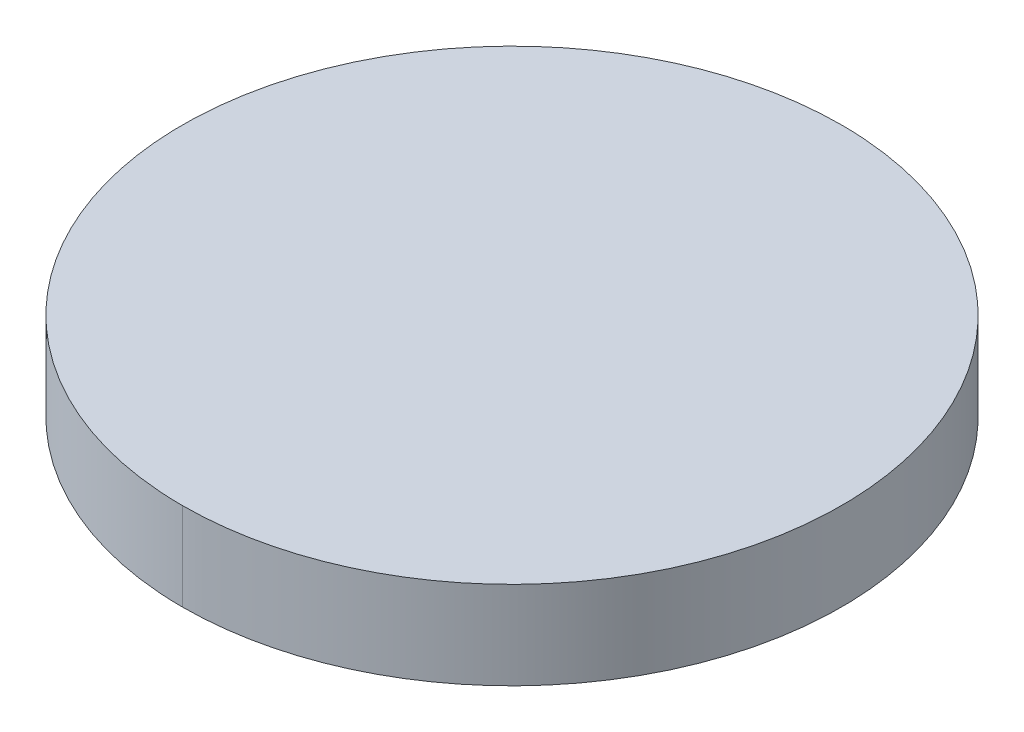
ISO-10303-21;
HEADER;
FILE_DESCRIPTION(('STEP AP214'),'2;1');
FILE_NAME('part.step','',(''),(''),'','','');
FILE_SCHEMA(('AUTOMOTIVE_DESIGN { 1 0 10303 214 1 1 1 1 }'));
ENDSEC;
DATA;
#1=APPLICATION_CONTEXT('core data for automotive mechanical design processes');
#2=APPLICATION_PROTOCOL_DEFINITION('international standard','automotive_design',2000,#1);
#3=PRODUCT_CONTEXT('',#1,'mechanical');
#4=PRODUCT('Part','Part','',(#3));
#5=PRODUCT_RELATED_PRODUCT_CATEGORY('part','',(#4));
#6=PRODUCT_DEFINITION_FORMATION('','',#4);
#7=PRODUCT_DEFINITION_CONTEXT('part definition',#1,'design');
#8=PRODUCT_DEFINITION('design','',#6,#7);
#9=PRODUCT_DEFINITION_SHAPE('','',#8);
#10=(LENGTH_UNIT() NAMED_UNIT(*) SI_UNIT(.MILLI.,.METRE.));
#11=(NAMED_UNIT(*) PLANE_ANGLE_UNIT() SI_UNIT($,.RADIAN.));
#12=(NAMED_UNIT(*) SI_UNIT($,.STERADIAN.) SOLID_ANGLE_UNIT());
#13=UNCERTAINTY_MEASURE_WITH_UNIT(LENGTH_MEASURE(1.E-05),#10,'distance_accuracy_value','');
#14=(GEOMETRIC_REPRESENTATION_CONTEXT(3) GLOBAL_UNCERTAINTY_ASSIGNED_CONTEXT((#13)) GLOBAL_UNIT_ASSIGNED_CONTEXT((#10,
#11,#12)) REPRESENTATION_CONTEXT('',''));
#15=CARTESIAN_POINT('',(0.,0.,0.));
#16=DIRECTION('',(0.,0.,1.));
#17=DIRECTION('',(1.,0.,0.));
#18=AXIS2_PLACEMENT_3D('',#15,#16,#17);
#19=CARTESIAN_POINT('',(-0.75,0.,-0.75));
#20=CARTESIAN_POINT('',(0.75,0.,-0.75));
#21=CARTESIAN_POINT('',(-0.75,0.,0.75));
#22=CARTESIAN_POINT('',(0.75,0.,0.75));
#23=(BOUNDED_SURFACE() B_SPLINE_SURFACE(1,1,((#19,#20),(#21,#22)),.UNSPECIFIED.,.F.,.F.,
.F.) B_SPLINE_SURFACE_WITH_KNOTS((2,2),(2,2),(-0.75,0.75),(-0.75,0.75),
.UNSPECIFIED.) GEOMETRIC_REPRESENTATION_ITEM() RATIONAL_B_SPLINE_SURFACE(((1.,1.),(1.,1.))) REPRESENTATION_ITEM('') SURFACE());
#24=CARTESIAN_POINT('',(0.,0.,-0.75));
#25=CARTESIAN_POINT('',(-0.75,0.,-0.75));
#26=CARTESIAN_POINT('',(-0.75,0.,0.));
#27=CARTESIAN_POINT('',(-0.75,0.,0.75));
#28=CARTESIAN_POINT('',(0.,0.,0.75));
#29=(BOUNDED_CURVE() B_SPLINE_CURVE(2,(#24,#25,#26,#27,#28),.UNSPECIFIED.,.F.,
.F.) B_SPLINE_CURVE_WITH_KNOTS((3,2,3),(3.14159265359,4.712388980385,6.28318530718),
.UNSPECIFIED.) CURVE() GEOMETRIC_REPRESENTATION_ITEM() RATIONAL_B_SPLINE_CURVE((1.,
0.707106781187,1.,0.707106781187,1.)) REPRESENTATION_ITEM(''));
#30=CARTESIAN_POINT('',(0.,0.,-0.75));
#31=VERTEX_POINT('',#30);
#32=CARTESIAN_POINT('',(0.,0.,0.75));
#33=VERTEX_POINT('',#32);
#34=EDGE_CURVE('E11',#31,#33,#29,.T.);
#35=CARTESIAN_POINT('',(0.,0.,0.75));
#36=CARTESIAN_POINT('',(0.75,0.,0.75));
#37=CARTESIAN_POINT('',(0.75,0.,0.));
#38=CARTESIAN_POINT('',(0.75,0.,-0.75));
#39=CARTESIAN_POINT('',(0.,0.,-0.75));
#40=(BOUNDED_CURVE() B_SPLINE_CURVE(2,(#35,#36,#37,#38,#39),.UNSPECIFIED.,.F.,
.F.) B_SPLINE_CURVE_WITH_KNOTS((3,2,3),(0.,1.570796326795,3.14159265359),
.UNSPECIFIED.) CURVE() GEOMETRIC_REPRESENTATION_ITEM() RATIONAL_B_SPLINE_CURVE((1.,
0.707106781187,1.,0.707106781187,1.)) REPRESENTATION_ITEM(''));
#41=EDGE_CURVE('E66',#33,#31,#40,.T.);
#42=ORIENTED_EDGE('',*,*,#34,.F.);
#43=ORIENTED_EDGE('',*,*,#41,.F.);
#44=EDGE_LOOP('',(#42,#43));
#45=FACE_BOUND('',#44,.T.);
#46=ADVANCED_FACE('F16',(#45),#23,.F.);
#47=CARTESIAN_POINT('',(-0.75,0.2,-0.75));
#48=CARTESIAN_POINT('',(0.75,0.2,-0.75));
#49=CARTESIAN_POINT('',(-0.75,0.2,0.75));
#50=CARTESIAN_POINT('',(0.75,0.2,0.75));
#51=(BOUNDED_SURFACE() B_SPLINE_SURFACE(1,1,((#47,#48),(#49,#50)),.UNSPECIFIED.,.F.,.F.,
.F.) B_SPLINE_SURFACE_WITH_KNOTS((2,2),(2,2),(-0.75,0.75),(-0.75,0.75),
.UNSPECIFIED.) GEOMETRIC_REPRESENTATION_ITEM() RATIONAL_B_SPLINE_SURFACE(((1.,1.),(1.,1.))) REPRESENTATION_ITEM('') SURFACE());
#52=CARTESIAN_POINT('',(0.,0.2,-0.75));
#53=CARTESIAN_POINT('',(-0.75,0.2,-0.75));
#54=CARTESIAN_POINT('',(-0.75,0.2,0.));
#55=CARTESIAN_POINT('',(-0.75,0.2,0.75));
#56=CARTESIAN_POINT('',(0.,0.2,0.75));
#57=(BOUNDED_CURVE() B_SPLINE_CURVE(2,(#52,#53,#54,#55,#56),.UNSPECIFIED.,.F.,
.F.) B_SPLINE_CURVE_WITH_KNOTS((3,2,3),(3.14159265359,4.712388980385,6.28318530718),
.UNSPECIFIED.) CURVE() GEOMETRIC_REPRESENTATION_ITEM() RATIONAL_B_SPLINE_CURVE((1.,
0.707106781187,1.,0.707106781187,1.)) REPRESENTATION_ITEM(''));
#58=CARTESIAN_POINT('',(0.,0.2,-0.75));
#59=VERTEX_POINT('',#58);
#60=CARTESIAN_POINT('',(0.,0.2,0.75));
#61=VERTEX_POINT('',#60);
#62=EDGE_CURVE('E29',#59,#61,#57,.T.);
#63=CARTESIAN_POINT('',(0.,0.2,0.75));
#64=CARTESIAN_POINT('',(0.75,0.2,0.75));
#65=CARTESIAN_POINT('',(0.75,0.2,0.));
#66=CARTESIAN_POINT('',(0.75,0.2,-0.75));
#67=CARTESIAN_POINT('',(0.,0.2,-0.75));
#68=(BOUNDED_CURVE() B_SPLINE_CURVE(2,(#63,#64,#65,#66,#67),.UNSPECIFIED.,.F.,
.F.) B_SPLINE_CURVE_WITH_KNOTS((3,2,3),(0.,1.570796326795,3.14159265359),
.UNSPECIFIED.) CURVE() GEOMETRIC_REPRESENTATION_ITEM() RATIONAL_B_SPLINE_CURVE((1.,
0.707106781187,1.,0.707106781187,1.)) REPRESENTATION_ITEM(''));
#69=EDGE_CURVE('E56',#61,#59,#68,.T.);
#70=ORIENTED_EDGE('',*,*,#62,.T.);
#71=ORIENTED_EDGE('',*,*,#69,.T.);
#72=EDGE_LOOP('',(#70,#71));
#73=FACE_BOUND('',#72,.T.);
#74=ADVANCED_FACE('F18',(#73),#51,.T.);
#75=CARTESIAN_POINT('',(0.,0.2,0.75));
#76=CARTESIAN_POINT('',(0.,0.,0.75));
#77=CARTESIAN_POINT('',(-0.75,0.2,0.75));
#78=CARTESIAN_POINT('',(-0.75,0.,0.75));
#79=CARTESIAN_POINT('',(-0.75,0.2,0.));
#80=CARTESIAN_POINT('',(-0.75,0.,0.));
#81=CARTESIAN_POINT('',(-0.75,0.2,-0.75));
#82=CARTESIAN_POINT('',(-0.75,0.,-0.75));
#83=CARTESIAN_POINT('',(0.,0.2,-0.75));
#84=CARTESIAN_POINT('',(0.,0.,-0.75));
#85=(BOUNDED_SURFACE() B_SPLINE_SURFACE(2,1,((#75,#76),(#77,#78),(#79,#80),(#81,#82),(#83,#84)),
.UNSPECIFIED.,.F.,.F.,.F.) B_SPLINE_SURFACE_WITH_KNOTS((3,2,3),(2,2),(3.14159265359,
4.712388980385,6.28318530718),(0.,0.2),
.UNSPECIFIED.) GEOMETRIC_REPRESENTATION_ITEM() RATIONAL_B_SPLINE_SURFACE(((1.,1.),
(0.707106781187,0.707106781187),(1.,1.),(0.707106781187,0.707106781187),(1.,1.))) REPRESENTATION_ITEM('') SURFACE());
#86=CARTESIAN_POINT('',(0.,0.2,0.75));
#87=CARTESIAN_POINT('',(0.,0.,0.75));
#88=(BOUNDED_CURVE() B_SPLINE_CURVE(1,(#86,#87),.UNSPECIFIED.,.F.,
.F.) B_SPLINE_CURVE_WITH_KNOTS((2,2),(0.,0.2),
.UNSPECIFIED.) CURVE() GEOMETRIC_REPRESENTATION_ITEM() RATIONAL_B_SPLINE_CURVE((1.,1.)) REPRESENTATION_ITEM(''));
#89=EDGE_CURVE('E61',#61,#33,#88,.T.);
#90=CARTESIAN_POINT('',(0.,0.2,-0.75));
#91=CARTESIAN_POINT('',(0.,0.,-0.75));
#92=(BOUNDED_CURVE() B_SPLINE_CURVE(1,(#90,#91),.UNSPECIFIED.,.F.,
.F.) B_SPLINE_CURVE_WITH_KNOTS((2,2),(0.,0.2),
.UNSPECIFIED.) CURVE() GEOMETRIC_REPRESENTATION_ITEM() RATIONAL_B_SPLINE_CURVE((1.,1.)) REPRESENTATION_ITEM(''));
#93=EDGE_CURVE('E59',#59,#31,#92,.T.);
#94=ORIENTED_EDGE('',*,*,#89,.F.);
#95=ORIENTED_EDGE('',*,*,#62,.F.);
#96=ORIENTED_EDGE('',*,*,#93,.T.);
#97=ORIENTED_EDGE('',*,*,#34,.T.);
#98=EDGE_LOOP('',(#94,#95,#96,#97));
#99=FACE_BOUND('',#98,.T.);
#100=ADVANCED_FACE('F62',(#99),#85,.T.);
#101=CARTESIAN_POINT('',(0.,0.2,-0.75));
#102=CARTESIAN_POINT('',(0.,0.,-0.75));
#103=CARTESIAN_POINT('',(0.75,0.2,-0.75));
#104=CARTESIAN_POINT('',(0.75,0.,-0.75));
#105=CARTESIAN_POINT('',(0.75,0.2,0.));
#106=CARTESIAN_POINT('',(0.75,0.,0.));
#107=CARTESIAN_POINT('',(0.75,0.2,0.75));
#108=CARTESIAN_POINT('',(0.75,0.,0.75));
#109=CARTESIAN_POINT('',(0.,0.2,0.75));
#110=CARTESIAN_POINT('',(0.,0.,0.75));
#111=(BOUNDED_SURFACE() B_SPLINE_SURFACE(2,1,((#101,#102),(#103,#104),(#105,#106),(#107,#108),
(#109,#110)),.UNSPECIFIED.,.F.,.F.,.F.) B_SPLINE_SURFACE_WITH_KNOTS((3,2,3),(2,2),(0.,
1.570796326795,3.14159265359),(0.,0.2),
.UNSPECIFIED.) GEOMETRIC_REPRESENTATION_ITEM() RATIONAL_B_SPLINE_SURFACE(((1.,1.),
(0.707106781187,0.707106781187),(1.,1.),(0.707106781187,0.707106781187),(1.,1.))) REPRESENTATION_ITEM('') SURFACE());
#112=ORIENTED_EDGE('',*,*,#69,.F.);
#113=ORIENTED_EDGE('',*,*,#89,.T.);
#114=ORIENTED_EDGE('',*,*,#41,.T.);
#115=ORIENTED_EDGE('',*,*,#93,.F.);
#116=EDGE_LOOP('',(#112,#113,#114,#115));
#117=FACE_BOUND('',#116,.T.);
#118=ADVANCED_FACE('F68',(#117),#111,.T.);
#119=CLOSED_SHELL('',(#46,#74,#100,#118));
#120=MANIFOLD_SOLID_BREP('B1',#119);
#121=ADVANCED_BREP_SHAPE_REPRESENTATION('',(#18,#120),#14);
#122=SHAPE_DEFINITION_REPRESENTATION(#9,#121);
ENDSEC;
END-ISO-10303-21;
